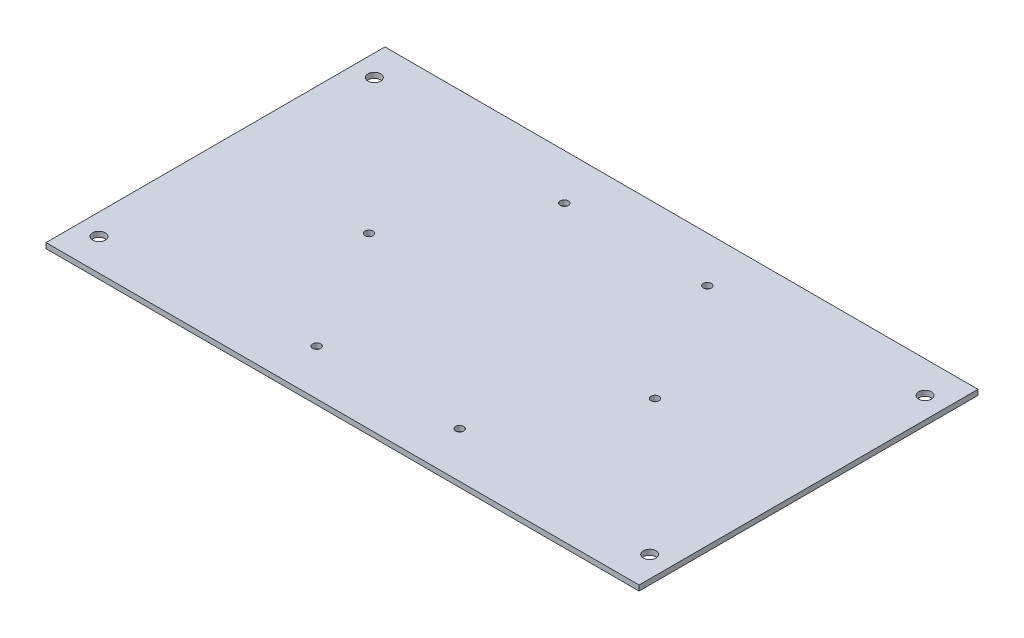
ISO-10303-21;
HEADER;
FILE_DESCRIPTION(('STEP AP214'),'2;1');
FILE_NAME('part.step','',(''),(''),'','','');
FILE_SCHEMA(('AUTOMOTIVE_DESIGN { 1 0 10303 214 1 1 1 1 }'));
ENDSEC;
DATA;
#1=APPLICATION_CONTEXT('core data for automotive mechanical design processes');
#2=APPLICATION_PROTOCOL_DEFINITION('international standard','automotive_design',2000,#1);
#3=PRODUCT_CONTEXT('',#1,'mechanical');
#4=PRODUCT('Part','Part','',(#3));
#5=PRODUCT_RELATED_PRODUCT_CATEGORY('part','',(#4));
#6=PRODUCT_DEFINITION_FORMATION('','',#4);
#7=PRODUCT_DEFINITION_CONTEXT('part definition',#1,'design');
#8=PRODUCT_DEFINITION('design','',#6,#7);
#9=PRODUCT_DEFINITION_SHAPE('','',#8);
#10=(LENGTH_UNIT() NAMED_UNIT(*) SI_UNIT(.MILLI.,.METRE.));
#11=(NAMED_UNIT(*) PLANE_ANGLE_UNIT() SI_UNIT($,.RADIAN.));
#12=(NAMED_UNIT(*) SI_UNIT($,.STERADIAN.) SOLID_ANGLE_UNIT());
#13=UNCERTAINTY_MEASURE_WITH_UNIT(LENGTH_MEASURE(1.E-05),#10,'distance_accuracy_value','');
#14=(GEOMETRIC_REPRESENTATION_CONTEXT(3) GLOBAL_UNCERTAINTY_ASSIGNED_CONTEXT((#13)) GLOBAL_UNIT_ASSIGNED_CONTEXT((#10,
#11,#12)) REPRESENTATION_CONTEXT('',''));
#15=CARTESIAN_POINT('',(0.,0.,0.));
#16=DIRECTION('',(0.,0.,1.));
#17=DIRECTION('',(1.,0.,0.));
#18=AXIS2_PLACEMENT_3D('',#15,#16,#17);
#19=CARTESIAN_POINT('',(0.,3.175,0.));
#20=DIRECTION('',(0.,1.,0.));
#21=DIRECTION('',(0.,0.,1.));
#22=AXIS2_PLACEMENT_3D('',#19,#20,#21);
#23=PLANE('',#22);
#24=CARTESIAN_POINT('',(-165.1,3.175,-82.55));
#25=DIRECTION('',(0.,-1.,0.));
#26=DIRECTION('',(0.,0.,-1.));
#27=AXIS2_PLACEMENT_3D('',#24,#25,#26);
#28=CIRCLE('',#27,3.81000000000001);
#29=CARTESIAN_POINT('',(-165.1,3.175,-86.36));
#30=VERTEX_POINT('',#29);
#31=EDGE_CURVE('E151',#30,#30,#28,.T.);
#32=ORIENTED_EDGE('',*,*,#31,.T.);
#33=EDGE_LOOP('',(#32));
#34=FACE_BOUND('',#33,.T.);
#35=CARTESIAN_POINT('',(165.1,3.175,82.55));
#36=DIRECTION('',(0.,-1.,0.));
#37=DIRECTION('',(0.,0.,-1.));
#38=AXIS2_PLACEMENT_3D('',#35,#36,#37);
#39=CIRCLE('',#38,3.81000000000001);
#40=CARTESIAN_POINT('',(165.1,3.175,78.74));
#41=VERTEX_POINT('',#40);
#42=EDGE_CURVE('E157',#41,#41,#39,.T.);
#43=ORIENTED_EDGE('',*,*,#42,.T.);
#44=EDGE_LOOP('',(#43));
#45=FACE_BOUND('',#44,.T.);
#46=CARTESIAN_POINT('',(165.1,3.175,-82.55));
#47=DIRECTION('',(0.,1.,0.));
#48=DIRECTION('',(0.,0.,1.));
#49=AXIS2_PLACEMENT_3D('',#46,#47,#48);
#50=CIRCLE('',#49,3.81000000000001);
#51=CARTESIAN_POINT('',(165.1,3.175,-78.74));
#52=VERTEX_POINT('',#51);
#53=EDGE_CURVE('E148',#52,#52,#50,.T.);
#54=ORIENTED_EDGE('',*,*,#53,.F.);
#55=EDGE_LOOP('',(#54));
#56=FACE_BOUND('',#55,.T.);
#57=CARTESIAN_POINT('',(-85.725,3.175,-5.41233724504764E-13));
#58=DIRECTION('',(0.,1.,0.));
#59=DIRECTION('',(0.,0.,1.));
#60=AXIS2_PLACEMENT_3D('',#57,#58,#59);
#61=CIRCLE('',#60,2.41299999999999);
#62=CARTESIAN_POINT('',(-85.725,3.175,2.41299999999945));
#63=VERTEX_POINT('',#62);
#64=EDGE_CURVE('E133',#63,#63,#61,.T.);
#65=ORIENTED_EDGE('',*,*,#64,.F.);
#66=EDGE_LOOP('',(#65));
#67=FACE_BOUND('',#66,.T.);
#68=CARTESIAN_POINT('',(42.8624999999999,3.175,74.2400277394211));
#69=DIRECTION('',(0.,1.,0.));
#70=DIRECTION('',(0.,0.,1.));
#71=AXIS2_PLACEMENT_3D('',#68,#69,#70);
#72=CIRCLE('',#71,2.41299999999999);
#73=CARTESIAN_POINT('',(42.8624999999999,3.175,76.6530277394211));
#74=VERTEX_POINT('',#73);
#75=EDGE_CURVE('E121',#74,#74,#72,.T.);
#76=ORIENTED_EDGE('',*,*,#75,.F.);
#77=EDGE_LOOP('',(#76));
#78=FACE_BOUND('',#77,.T.);
#79=CARTESIAN_POINT('',(42.8624999999998,3.175,-74.2400277394211));
#80=DIRECTION('',(0.,1.,0.));
#81=DIRECTION('',(0.,0.,1.));
#82=AXIS2_PLACEMENT_3D('',#79,#80,#81);
#83=CIRCLE('',#82,2.41299999999999);
#84=CARTESIAN_POINT('',(42.8624999999998,3.175,-71.8270277394211));
#85=VERTEX_POINT('',#84);
#86=EDGE_CURVE('E100',#85,#85,#83,.T.);
#87=ORIENTED_EDGE('',*,*,#86,.F.);
#88=EDGE_LOOP('',(#87));
#89=FACE_BOUND('',#88,.T.);
#90=DIRECTION('',(0.,0.,-1.));
#91=VECTOR('',#90,1.);
#92=CARTESIAN_POINT('',(177.8,3.175,-101.6));
#93=LINE('',#92,#91);
#94=CARTESIAN_POINT('',(177.8,3.175,101.6));
#95=VERTEX_POINT('',#94);
#96=CARTESIAN_POINT('',(177.8,3.175,-101.6));
#97=VERTEX_POINT('',#96);
#98=EDGE_CURVE('E85',#95,#97,#93,.T.);
#99=ORIENTED_EDGE('',*,*,#98,.T.);
#100=DIRECTION('',(-1.,0.,0.));
#101=VECTOR('',#100,1.);
#102=CARTESIAN_POINT('',(-177.8,3.175,-101.6));
#103=LINE('',#102,#101);
#104=CARTESIAN_POINT('',(-177.8,3.175,-101.6));
#105=VERTEX_POINT('',#104);
#106=EDGE_CURVE('E80',#97,#105,#103,.T.);
#107=ORIENTED_EDGE('',*,*,#106,.T.);
#108=DIRECTION('',(0.,0.,1.));
#109=VECTOR('',#108,1.);
#110=CARTESIAN_POINT('',(-177.8,3.175,-101.6));
#111=LINE('',#110,#109);
#112=CARTESIAN_POINT('',(-177.8,3.175,101.6));
#113=VERTEX_POINT('',#112);
#114=EDGE_CURVE('E83',#105,#113,#111,.T.);
#115=ORIENTED_EDGE('',*,*,#114,.T.);
#116=DIRECTION('',(1.,0.,0.));
#117=VECTOR('',#116,1.);
#118=CARTESIAN_POINT('',(-177.8,3.175,101.6));
#119=LINE('',#118,#117);
#120=EDGE_CURVE('E50',#113,#95,#119,.T.);
#121=ORIENTED_EDGE('',*,*,#120,.T.);
#122=EDGE_LOOP('',(#99,#107,#115,#121));
#123=FACE_BOUND('',#122,.T.);
#124=CARTESIAN_POINT('',(85.725,3.175,0.));
#125=DIRECTION('',(0.,1.,0.));
#126=DIRECTION('',(0.,0.,1.));
#127=AXIS2_PLACEMENT_3D('',#124,#125,#126);
#128=CIRCLE('',#127,2.413);
#129=CARTESIAN_POINT('',(85.725,3.175,2.41299999999997));
#130=VERTEX_POINT('',#129);
#131=EDGE_CURVE('E115',#130,#130,#128,.T.);
#132=ORIENTED_EDGE('',*,*,#131,.F.);
#133=EDGE_LOOP('',(#132));
#134=FACE_BOUND('',#133,.T.);
#135=CARTESIAN_POINT('',(-42.8625000000003,3.175,74.2400277394208));
#136=DIRECTION('',(0.,1.,0.));
#137=DIRECTION('',(0.,0.,1.));
#138=AXIS2_PLACEMENT_3D('',#135,#136,#137);
#139=CIRCLE('',#138,2.41299999999999);
#140=CARTESIAN_POINT('',(-42.8625000000003,3.175,76.6530277394208));
#141=VERTEX_POINT('',#140);
#142=EDGE_CURVE('E127',#141,#141,#139,.T.);
#143=ORIENTED_EDGE('',*,*,#142,.F.);
#144=EDGE_LOOP('',(#143));
#145=FACE_BOUND('',#144,.T.);
#146=CARTESIAN_POINT('',(-42.8624999999993,3.175,-74.2400277394214));
#147=DIRECTION('',(0.,1.,0.));
#148=DIRECTION('',(0.,0.,1.));
#149=AXIS2_PLACEMENT_3D('',#146,#147,#148);
#150=CIRCLE('',#149,2.41299999999998);
#151=CARTESIAN_POINT('',(-42.8624999999993,3.175,-71.8270277394214));
#152=VERTEX_POINT('',#151);
#153=EDGE_CURVE('E139',#152,#152,#150,.T.);
#154=ORIENTED_EDGE('',*,*,#153,.F.);
#155=EDGE_LOOP('',(#154));
#156=FACE_BOUND('',#155,.T.);
#157=CARTESIAN_POINT('',(-165.1,3.175,82.55));
#158=DIRECTION('',(0.,1.,0.));
#159=DIRECTION('',(0.,0.,1.));
#160=AXIS2_PLACEMENT_3D('',#157,#158,#159);
#161=CIRCLE('',#160,3.81000000000004);
#162=CARTESIAN_POINT('',(-165.1,3.175,86.36));
#163=VERTEX_POINT('',#162);
#164=EDGE_CURVE('E163',#163,#163,#161,.T.);
#165=ORIENTED_EDGE('',*,*,#164,.F.);
#166=EDGE_LOOP('',(#165));
#167=FACE_BOUND('',#166,.T.);
#168=ADVANCED_FACE('F33',(#34,#45,#56,#67,#78,#89,#123,#134,#145,#156,#167),#23,.T.);
#169=CARTESIAN_POINT('',(0.,0.,0.));
#170=DIRECTION('',(0.,1.,0.));
#171=DIRECTION('',(0.,0.,1.));
#172=AXIS2_PLACEMENT_3D('',#169,#170,#171);
#173=PLANE('',#172);
#174=CARTESIAN_POINT('',(-165.1,0.,-82.55));
#175=DIRECTION('',(0.,-1.,0.));
#176=DIRECTION('',(0.,0.,-1.));
#177=AXIS2_PLACEMENT_3D('',#174,#175,#176);
#178=CIRCLE('',#177,3.81000000000001);
#179=CARTESIAN_POINT('',(-165.1,0.,-86.36));
#180=VERTEX_POINT('',#179);
#181=EDGE_CURVE('E166',#180,#180,#178,.T.);
#182=ORIENTED_EDGE('',*,*,#181,.F.);
#183=EDGE_LOOP('',(#182));
#184=FACE_BOUND('',#183,.T.);
#185=CARTESIAN_POINT('',(-42.8624999999993,0.,-74.2400277394214));
#186=DIRECTION('',(0.,1.,0.));
#187=DIRECTION('',(0.,0.,1.));
#188=AXIS2_PLACEMENT_3D('',#185,#186,#187);
#189=CIRCLE('',#188,2.41299999999998);
#190=CARTESIAN_POINT('',(-42.8624999999993,0.,-71.8270277394214));
#191=VERTEX_POINT('',#190);
#192=EDGE_CURVE('E142',#191,#191,#189,.T.);
#193=ORIENTED_EDGE('',*,*,#192,.T.);
#194=EDGE_LOOP('',(#193));
#195=FACE_BOUND('',#194,.T.);
#196=CARTESIAN_POINT('',(-85.725,0.,-5.41233724504764E-13));
#197=DIRECTION('',(0.,1.,0.));
#198=DIRECTION('',(0.,0.,1.));
#199=AXIS2_PLACEMENT_3D('',#196,#197,#198);
#200=CIRCLE('',#199,2.41299999999999);
#201=CARTESIAN_POINT('',(-85.725,0.,2.41299999999945));
#202=VERTEX_POINT('',#201);
#203=EDGE_CURVE('E136',#202,#202,#200,.T.);
#204=ORIENTED_EDGE('',*,*,#203,.T.);
#205=EDGE_LOOP('',(#204));
#206=FACE_BOUND('',#205,.T.);
#207=CARTESIAN_POINT('',(-42.8625000000003,0.,74.2400277394208));
#208=DIRECTION('',(0.,1.,0.));
#209=DIRECTION('',(0.,0.,1.));
#210=AXIS2_PLACEMENT_3D('',#207,#208,#209);
#211=CIRCLE('',#210,2.41299999999999);
#212=CARTESIAN_POINT('',(-42.8625000000003,0.,76.6530277394208));
#213=VERTEX_POINT('',#212);
#214=EDGE_CURVE('E130',#213,#213,#211,.T.);
#215=ORIENTED_EDGE('',*,*,#214,.T.);
#216=EDGE_LOOP('',(#215));
#217=FACE_BOUND('',#216,.T.);
#218=CARTESIAN_POINT('',(42.8624999999999,0.,74.2400277394211));
#219=DIRECTION('',(0.,1.,0.));
#220=DIRECTION('',(0.,0.,1.));
#221=AXIS2_PLACEMENT_3D('',#218,#219,#220);
#222=CIRCLE('',#221,2.41299999999999);
#223=CARTESIAN_POINT('',(42.8624999999999,0.,76.6530277394211));
#224=VERTEX_POINT('',#223);
#225=EDGE_CURVE('E124',#224,#224,#222,.T.);
#226=ORIENTED_EDGE('',*,*,#225,.T.);
#227=EDGE_LOOP('',(#226));
#228=FACE_BOUND('',#227,.T.);
#229=CARTESIAN_POINT('',(85.725,0.,0.));
#230=DIRECTION('',(0.,1.,0.));
#231=DIRECTION('',(0.,0.,1.));
#232=AXIS2_PLACEMENT_3D('',#229,#230,#231);
#233=CIRCLE('',#232,2.413);
#234=CARTESIAN_POINT('',(85.725,0.,2.41299999999997));
#235=VERTEX_POINT('',#234);
#236=EDGE_CURVE('E118',#235,#235,#233,.T.);
#237=ORIENTED_EDGE('',*,*,#236,.T.);
#238=EDGE_LOOP('',(#237));
#239=FACE_BOUND('',#238,.T.);
#240=CARTESIAN_POINT('',(42.8624999999998,0.,-74.2400277394211));
#241=DIRECTION('',(0.,1.,0.));
#242=DIRECTION('',(0.,0.,1.));
#243=AXIS2_PLACEMENT_3D('',#240,#241,#242);
#244=CIRCLE('',#243,2.41299999999999);
#245=CARTESIAN_POINT('',(42.8624999999998,0.,-71.8270277394211));
#246=VERTEX_POINT('',#245);
#247=EDGE_CURVE('E112',#246,#246,#244,.T.);
#248=ORIENTED_EDGE('',*,*,#247,.T.);
#249=EDGE_LOOP('',(#248));
#250=FACE_BOUND('',#249,.T.);
#251=DIRECTION('',(0.,0.,-1.));
#252=VECTOR('',#251,1.);
#253=CARTESIAN_POINT('',(177.8,0.,-101.6));
#254=LINE('',#253,#252);
#255=CARTESIAN_POINT('',(177.8,0.,101.6));
#256=VERTEX_POINT('',#255);
#257=CARTESIAN_POINT('',(177.8,0.,-101.6));
#258=VERTEX_POINT('',#257);
#259=EDGE_CURVE('E97',#256,#258,#254,.T.);
#260=ORIENTED_EDGE('',*,*,#259,.F.);
#261=DIRECTION('',(1.,0.,0.));
#262=VECTOR('',#261,1.);
#263=CARTESIAN_POINT('',(-177.8,0.,101.6));
#264=LINE('',#263,#262);
#265=CARTESIAN_POINT('',(-177.8,0.,101.6));
#266=VERTEX_POINT('',#265);
#267=EDGE_CURVE('E73',#266,#256,#264,.T.);
#268=ORIENTED_EDGE('',*,*,#267,.F.);
#269=DIRECTION('',(0.,0.,1.));
#270=VECTOR('',#269,1.);
#271=CARTESIAN_POINT('',(-177.8,0.,-101.6));
#272=LINE('',#271,#270);
#273=CARTESIAN_POINT('',(-177.8,0.,-101.6));
#274=VERTEX_POINT('',#273);
#275=EDGE_CURVE('E67',#274,#266,#272,.T.);
#276=ORIENTED_EDGE('',*,*,#275,.F.);
#277=DIRECTION('',(-1.,0.,0.));
#278=VECTOR('',#277,1.);
#279=CARTESIAN_POINT('',(-177.8,0.,-101.6));
#280=LINE('',#279,#278);
#281=EDGE_CURVE('E89',#258,#274,#280,.T.);
#282=ORIENTED_EDGE('',*,*,#281,.F.);
#283=EDGE_LOOP('',(#260,#268,#276,#282));
#284=FACE_BOUND('',#283,.T.);
#285=CARTESIAN_POINT('',(165.1,0.,-82.55));
#286=DIRECTION('',(0.,1.,0.));
#287=DIRECTION('',(0.,0.,1.));
#288=AXIS2_PLACEMENT_3D('',#285,#286,#287);
#289=CIRCLE('',#288,3.81000000000001);
#290=CARTESIAN_POINT('',(165.1,0.,-78.74));
#291=VERTEX_POINT('',#290);
#292=EDGE_CURVE('E145',#291,#291,#289,.T.);
#293=ORIENTED_EDGE('',*,*,#292,.T.);
#294=EDGE_LOOP('',(#293));
#295=FACE_BOUND('',#294,.T.);
#296=CARTESIAN_POINT('',(165.1,0.,82.55));
#297=DIRECTION('',(0.,-1.,0.));
#298=DIRECTION('',(0.,0.,-1.));
#299=AXIS2_PLACEMENT_3D('',#296,#297,#298);
#300=CIRCLE('',#299,3.81000000000001);
#301=CARTESIAN_POINT('',(165.1,0.,78.74));
#302=VERTEX_POINT('',#301);
#303=EDGE_CURVE('E154',#302,#302,#300,.T.);
#304=ORIENTED_EDGE('',*,*,#303,.F.);
#305=EDGE_LOOP('',(#304));
#306=FACE_BOUND('',#305,.T.);
#307=CARTESIAN_POINT('',(-165.1,0.,82.55));
#308=DIRECTION('',(0.,1.,0.));
#309=DIRECTION('',(0.,0.,1.));
#310=AXIS2_PLACEMENT_3D('',#307,#308,#309);
#311=CIRCLE('',#310,3.81000000000004);
#312=CARTESIAN_POINT('',(-165.1,0.,86.36));
#313=VERTEX_POINT('',#312);
#314=EDGE_CURVE('E160',#313,#313,#311,.T.);
#315=ORIENTED_EDGE('',*,*,#314,.T.);
#316=EDGE_LOOP('',(#315));
#317=FACE_BOUND('',#316,.T.);
#318=ADVANCED_FACE('F108',(#184,#195,#206,#217,#228,#239,#250,#284,#295,#306,#317),#173,.F.);
#319=CARTESIAN_POINT('',(177.8,3.175,-101.6));
#320=DIRECTION('',(-1.,0.,0.));
#321=DIRECTION('',(0.,0.,1.));
#322=AXIS2_PLACEMENT_3D('',#319,#320,#321);
#323=PLANE('',#322);
#324=ORIENTED_EDGE('',*,*,#259,.T.);
#325=DIRECTION('',(0.,-1.,0.));
#326=VECTOR('',#325,1.);
#327=CARTESIAN_POINT('',(177.8,3.175,-101.6));
#328=LINE('',#327,#326);
#329=EDGE_CURVE('E11',#97,#258,#328,.T.);
#330=ORIENTED_EDGE('',*,*,#329,.F.);
#331=ORIENTED_EDGE('',*,*,#98,.F.);
#332=DIRECTION('',(0.,-1.,0.));
#333=VECTOR('',#332,1.);
#334=CARTESIAN_POINT('',(177.8,3.175,101.6));
#335=LINE('',#334,#333);
#336=EDGE_CURVE('E93',#95,#256,#335,.T.);
#337=ORIENTED_EDGE('',*,*,#336,.T.);
#338=EDGE_LOOP('',(#324,#330,#331,#337));
#339=FACE_BOUND('',#338,.T.);
#340=ADVANCED_FACE('F35',(#339),#323,.F.);
#341=CARTESIAN_POINT('',(-177.8,3.175,-101.6));
#342=DIRECTION('',(0.,0.,1.));
#343=DIRECTION('',(1.,0.,0.));
#344=AXIS2_PLACEMENT_3D('',#341,#342,#343);
#345=PLANE('',#344);
#346=ORIENTED_EDGE('',*,*,#281,.T.);
#347=DIRECTION('',(0.,-1.,0.));
#348=VECTOR('',#347,1.);
#349=CARTESIAN_POINT('',(-177.8,3.175,-101.6));
#350=LINE('',#349,#348);
#351=EDGE_CURVE('E42',#105,#274,#350,.T.);
#352=ORIENTED_EDGE('',*,*,#351,.F.);
#353=ORIENTED_EDGE('',*,*,#106,.F.);
#354=ORIENTED_EDGE('',*,*,#329,.T.);
#355=EDGE_LOOP('',(#346,#352,#353,#354));
#356=FACE_BOUND('',#355,.T.);
#357=ADVANCED_FACE('F88',(#356),#345,.F.);
#358=CARTESIAN_POINT('',(-177.8,3.175,-101.6));
#359=DIRECTION('',(1.,0.,0.));
#360=DIRECTION('',(0.,0.,-1.));
#361=AXIS2_PLACEMENT_3D('',#358,#359,#360);
#362=PLANE('',#361);
#363=ORIENTED_EDGE('',*,*,#275,.T.);
#364=DIRECTION('',(0.,-1.,0.));
#365=VECTOR('',#364,1.);
#366=CARTESIAN_POINT('',(-177.8,3.175,101.6));
#367=LINE('',#366,#365);
#368=EDGE_CURVE('E90',#113,#266,#367,.T.);
#369=ORIENTED_EDGE('',*,*,#368,.F.);
#370=ORIENTED_EDGE('',*,*,#114,.F.);
#371=ORIENTED_EDGE('',*,*,#351,.T.);
#372=EDGE_LOOP('',(#363,#369,#370,#371));
#373=FACE_BOUND('',#372,.T.);
#374=ADVANCED_FACE('F91',(#373),#362,.F.);
#375=CARTESIAN_POINT('',(-177.8,3.175,101.6));
#376=DIRECTION('',(0.,0.,-1.));
#377=DIRECTION('',(-1.,0.,0.));
#378=AXIS2_PLACEMENT_3D('',#375,#376,#377);
#379=PLANE('',#378);
#380=ORIENTED_EDGE('',*,*,#267,.T.);
#381=ORIENTED_EDGE('',*,*,#336,.F.);
#382=ORIENTED_EDGE('',*,*,#120,.F.);
#383=ORIENTED_EDGE('',*,*,#368,.T.);
#384=EDGE_LOOP('',(#380,#381,#382,#383));
#385=FACE_BOUND('',#384,.T.);
#386=ADVANCED_FACE('F105',(#385),#379,.F.);
#387=CARTESIAN_POINT('',(42.8624999999998,3.175,-74.2400277394211));
#388=DIRECTION('',(0.,-1.,0.));
#389=DIRECTION('',(0.,0.,-1.));
#390=AXIS2_PLACEMENT_3D('',#387,#388,#389);
#391=CYLINDRICAL_SURFACE('',#390,2.41299999999999);
#392=ORIENTED_EDGE('',*,*,#86,.T.);
#393=EDGE_LOOP('',(#392));
#394=FACE_BOUND('',#393,.T.);
#395=ORIENTED_EDGE('',*,*,#247,.F.);
#396=EDGE_LOOP('',(#395));
#397=FACE_BOUND('',#396,.T.);
#398=ADVANCED_FACE('F193',(#394,#397),#391,.F.);
#399=CARTESIAN_POINT('',(85.725,3.175,0.));
#400=DIRECTION('',(0.,-1.,0.));
#401=DIRECTION('',(0.,0.,-1.));
#402=AXIS2_PLACEMENT_3D('',#399,#400,#401);
#403=CYLINDRICAL_SURFACE('',#402,2.413);
#404=ORIENTED_EDGE('',*,*,#131,.T.);
#405=EDGE_LOOP('',(#404));
#406=FACE_BOUND('',#405,.T.);
#407=ORIENTED_EDGE('',*,*,#236,.F.);
#408=EDGE_LOOP('',(#407));
#409=FACE_BOUND('',#408,.T.);
#410=ADVANCED_FACE('F262',(#406,#409),#403,.F.);
#411=CARTESIAN_POINT('',(42.8624999999999,3.175,74.2400277394211));
#412=DIRECTION('',(0.,-1.,0.));
#413=DIRECTION('',(0.,0.,-1.));
#414=AXIS2_PLACEMENT_3D('',#411,#412,#413);
#415=CYLINDRICAL_SURFACE('',#414,2.41299999999999);
#416=ORIENTED_EDGE('',*,*,#75,.T.);
#417=EDGE_LOOP('',(#416));
#418=FACE_BOUND('',#417,.T.);
#419=ORIENTED_EDGE('',*,*,#225,.F.);
#420=EDGE_LOOP('',(#419));
#421=FACE_BOUND('',#420,.T.);
#422=ADVANCED_FACE('F259',(#418,#421),#415,.F.);
#423=CARTESIAN_POINT('',(-42.8625000000003,3.175,74.2400277394208));
#424=DIRECTION('',(0.,-1.,0.));
#425=DIRECTION('',(0.,0.,-1.));
#426=AXIS2_PLACEMENT_3D('',#423,#424,#425);
#427=CYLINDRICAL_SURFACE('',#426,2.41299999999999);
#428=ORIENTED_EDGE('',*,*,#142,.T.);
#429=EDGE_LOOP('',(#428));
#430=FACE_BOUND('',#429,.T.);
#431=ORIENTED_EDGE('',*,*,#214,.F.);
#432=EDGE_LOOP('',(#431));
#433=FACE_BOUND('',#432,.T.);
#434=ADVANCED_FACE('F255',(#430,#433),#427,.F.);
#435=CARTESIAN_POINT('',(-85.725,3.175,-5.41233724504764E-13));
#436=DIRECTION('',(0.,-1.,0.));
#437=DIRECTION('',(0.,0.,-1.));
#438=AXIS2_PLACEMENT_3D('',#435,#436,#437);
#439=CYLINDRICAL_SURFACE('',#438,2.41299999999999);
#440=ORIENTED_EDGE('',*,*,#64,.T.);
#441=EDGE_LOOP('',(#440));
#442=FACE_BOUND('',#441,.T.);
#443=ORIENTED_EDGE('',*,*,#203,.F.);
#444=EDGE_LOOP('',(#443));
#445=FACE_BOUND('',#444,.T.);
#446=ADVANCED_FACE('F251',(#442,#445),#439,.F.);
#447=CARTESIAN_POINT('',(-42.8624999999993,3.175,-74.2400277394214));
#448=DIRECTION('',(0.,-1.,0.));
#449=DIRECTION('',(0.,0.,-1.));
#450=AXIS2_PLACEMENT_3D('',#447,#448,#449);
#451=CYLINDRICAL_SURFACE('',#450,2.41299999999998);
#452=ORIENTED_EDGE('',*,*,#153,.T.);
#453=EDGE_LOOP('',(#452));
#454=FACE_BOUND('',#453,.T.);
#455=ORIENTED_EDGE('',*,*,#192,.F.);
#456=EDGE_LOOP('',(#455));
#457=FACE_BOUND('',#456,.T.);
#458=ADVANCED_FACE('F223',(#454,#457),#451,.F.);
#459=CARTESIAN_POINT('',(165.1,0.,-82.55));
#460=DIRECTION('',(0.,1.,0.));
#461=DIRECTION('',(0.,0.,1.));
#462=AXIS2_PLACEMENT_3D('',#459,#460,#461);
#463=CYLINDRICAL_SURFACE('',#462,3.81000000000001);
#464=ORIENTED_EDGE('',*,*,#292,.F.);
#465=EDGE_LOOP('',(#464));
#466=FACE_BOUND('',#465,.T.);
#467=ORIENTED_EDGE('',*,*,#53,.T.);
#468=EDGE_LOOP('',(#467));
#469=FACE_BOUND('',#468,.T.);
#470=ADVANCED_FACE('F218',(#466,#469),#463,.F.);
#471=CARTESIAN_POINT('',(165.1,0.,82.55));
#472=DIRECTION('',(0.,1.,0.));
#473=DIRECTION('',(0.,0.,1.));
#474=AXIS2_PLACEMENT_3D('',#471,#472,#473);
#475=CYLINDRICAL_SURFACE('',#474,3.81000000000001);
#476=ORIENTED_EDGE('',*,*,#303,.T.);
#477=EDGE_LOOP('',(#476));
#478=FACE_BOUND('',#477,.T.);
#479=ORIENTED_EDGE('',*,*,#42,.F.);
#480=EDGE_LOOP('',(#479));
#481=FACE_BOUND('',#480,.T.);
#482=ADVANCED_FACE('F182',(#478,#481),#475,.F.);
#483=CARTESIAN_POINT('',(-165.1,0.,82.55));
#484=DIRECTION('',(0.,1.,0.));
#485=DIRECTION('',(0.,0.,1.));
#486=AXIS2_PLACEMENT_3D('',#483,#484,#485);
#487=CYLINDRICAL_SURFACE('',#486,3.81000000000004);
#488=ORIENTED_EDGE('',*,*,#314,.F.);
#489=EDGE_LOOP('',(#488));
#490=FACE_BOUND('',#489,.T.);
#491=ORIENTED_EDGE('',*,*,#164,.T.);
#492=EDGE_LOOP('',(#491));
#493=FACE_BOUND('',#492,.T.);
#494=ADVANCED_FACE('F176',(#490,#493),#487,.F.);
#495=CARTESIAN_POINT('',(-165.1,0.,-82.55));
#496=DIRECTION('',(0.,1.,0.));
#497=DIRECTION('',(0.,0.,1.));
#498=AXIS2_PLACEMENT_3D('',#495,#496,#497);
#499=CYLINDRICAL_SURFACE('',#498,3.81000000000001);
#500=ORIENTED_EDGE('',*,*,#181,.T.);
#501=EDGE_LOOP('',(#500));
#502=FACE_BOUND('',#501,.T.);
#503=ORIENTED_EDGE('',*,*,#31,.F.);
#504=EDGE_LOOP('',(#503));
#505=FACE_BOUND('',#504,.T.);
#506=ADVANCED_FACE('F174',(#502,#505),#499,.F.);
#507=CLOSED_SHELL('',(#168,#318,#340,#357,#374,#386,#398,#410,#422,#434,#446,#458,#470,#482,
#494,#506));
#508=MANIFOLD_SOLID_BREP('B2',#507);
#509=ADVANCED_BREP_SHAPE_REPRESENTATION('',(#18,#508),#14);
#510=SHAPE_DEFINITION_REPRESENTATION(#9,#509);
ENDSEC;
END-ISO-10303-21;
